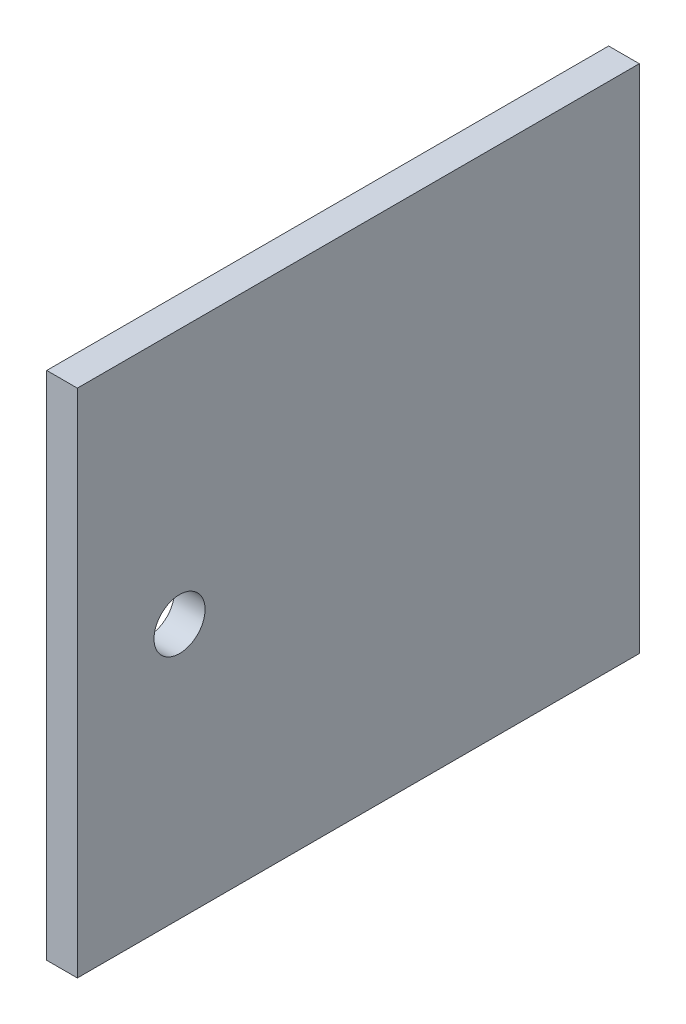
ISO-10303-21;
HEADER;
FILE_DESCRIPTION(('STEP AP214'),'2;1');
FILE_NAME('part.step','',(''),(''),'','','');
FILE_SCHEMA(('AUTOMOTIVE_DESIGN { 1 0 10303 214 1 1 1 1 }'));
ENDSEC;
DATA;
#1=APPLICATION_CONTEXT('core data for automotive mechanical design processes');
#2=APPLICATION_PROTOCOL_DEFINITION('international standard','automotive_design',2000,#1);
#3=PRODUCT_CONTEXT('',#1,'mechanical');
#4=PRODUCT('Part','Part','',(#3));
#5=PRODUCT_RELATED_PRODUCT_CATEGORY('part','',(#4));
#6=PRODUCT_DEFINITION_FORMATION('','',#4);
#7=PRODUCT_DEFINITION_CONTEXT('part definition',#1,'design');
#8=PRODUCT_DEFINITION('design','',#6,#7);
#9=PRODUCT_DEFINITION_SHAPE('','',#8);
#10=(LENGTH_UNIT() NAMED_UNIT(*) SI_UNIT(.MILLI.,.METRE.));
#11=(NAMED_UNIT(*) PLANE_ANGLE_UNIT() SI_UNIT($,.RADIAN.));
#12=(NAMED_UNIT(*) SI_UNIT($,.STERADIAN.) SOLID_ANGLE_UNIT());
#13=UNCERTAINTY_MEASURE_WITH_UNIT(LENGTH_MEASURE(1.E-05),#10,'distance_accuracy_value','');
#14=(GEOMETRIC_REPRESENTATION_CONTEXT(3) GLOBAL_UNCERTAINTY_ASSIGNED_CONTEXT((#13)) GLOBAL_UNIT_ASSIGNED_CONTEXT((#10,
#11,#12)) REPRESENTATION_CONTEXT('',''));
#15=CARTESIAN_POINT('',(0.,0.,0.));
#16=DIRECTION('',(0.,0.,1.));
#17=DIRECTION('',(1.,0.,0.));
#18=AXIS2_PLACEMENT_3D('',#15,#16,#17);
#19=CARTESIAN_POINT('',(-3.,0.,0.));
#20=DIRECTION('',(0.,0.,-1.));
#21=DIRECTION('',(0.,1.,0.));
#22=AXIS2_PLACEMENT_3D('',#19,#20,#21);
#23=PLANE('',#22);
#24=DIRECTION('',(0.,1.,0.));
#25=VECTOR('',#24,1.);
#26=CARTESIAN_POINT('',(0.,0.,0.));
#27=LINE('',#26,#25);
#28=CARTESIAN_POINT('',(0.,-50.,0.));
#29=VERTEX_POINT('',#28);
#30=CARTESIAN_POINT('',(0.,0.,0.));
#31=VERTEX_POINT('',#30);
#32=EDGE_CURVE('E86',#29,#31,#27,.T.);
#33=ORIENTED_EDGE('',*,*,#32,.F.);
#34=DIRECTION('',(1.,0.,0.));
#35=VECTOR('',#34,1.);
#36=CARTESIAN_POINT('',(-3.,-50.,0.));
#37=LINE('',#36,#35);
#38=CARTESIAN_POINT('',(-3.,-50.,0.));
#39=VERTEX_POINT('',#38);
#40=EDGE_CURVE('E32',#39,#29,#37,.T.);
#41=ORIENTED_EDGE('',*,*,#40,.F.);
#42=DIRECTION('',(0.,1.,0.));
#43=VECTOR('',#42,1.);
#44=CARTESIAN_POINT('',(-3.,0.,0.));
#45=LINE('',#44,#43);
#46=CARTESIAN_POINT('',(-3.,0.,0.));
#47=VERTEX_POINT('',#46);
#48=EDGE_CURVE('E71',#39,#47,#45,.T.);
#49=ORIENTED_EDGE('',*,*,#48,.T.);
#50=DIRECTION('',(1.,0.,0.));
#51=VECTOR('',#50,1.);
#52=CARTESIAN_POINT('',(-3.,0.,0.));
#53=LINE('',#52,#51);
#54=EDGE_CURVE('E10',#47,#31,#53,.T.);
#55=ORIENTED_EDGE('',*,*,#54,.T.);
#56=EDGE_LOOP('',(#33,#41,#49,#55));
#57=FACE_BOUND('',#56,.T.);
#58=ADVANCED_FACE('F16',(#57),#23,.T.);
#59=CARTESIAN_POINT('',(-3.,0.,55.));
#60=DIRECTION('',(0.,1.,0.));
#61=DIRECTION('',(0.,0.,1.));
#62=AXIS2_PLACEMENT_3D('',#59,#60,#61);
#63=PLANE('',#62);
#64=DIRECTION('',(0.,0.,1.));
#65=VECTOR('',#64,1.);
#66=CARTESIAN_POINT('',(0.,0.,55.));
#67=LINE('',#66,#65);
#68=CARTESIAN_POINT('',(0.,0.,55.));
#69=VERTEX_POINT('',#68);
#70=EDGE_CURVE('E83',#31,#69,#67,.T.);
#71=ORIENTED_EDGE('',*,*,#70,.F.);
#72=ORIENTED_EDGE('',*,*,#54,.F.);
#73=DIRECTION('',(0.,0.,1.));
#74=VECTOR('',#73,1.);
#75=CARTESIAN_POINT('',(-3.,0.,55.));
#76=LINE('',#75,#74);
#77=CARTESIAN_POINT('',(-3.,0.,55.));
#78=VERTEX_POINT('',#77);
#79=EDGE_CURVE('E67',#47,#78,#76,.T.);
#80=ORIENTED_EDGE('',*,*,#79,.T.);
#81=DIRECTION('',(1.,0.,0.));
#82=VECTOR('',#81,1.);
#83=CARTESIAN_POINT('',(-3.,0.,55.));
#84=LINE('',#83,#82);
#85=EDGE_CURVE('E24',#78,#69,#84,.T.);
#86=ORIENTED_EDGE('',*,*,#85,.T.);
#87=EDGE_LOOP('',(#71,#72,#80,#86));
#88=FACE_BOUND('',#87,.T.);
#89=ADVANCED_FACE('F68',(#88),#63,.T.);
#90=CARTESIAN_POINT('',(-3.,-50.,55.));
#91=DIRECTION('',(0.,0.,1.));
#92=DIRECTION('',(1.,0.,0.));
#93=AXIS2_PLACEMENT_3D('',#90,#91,#92);
#94=PLANE('',#93);
#95=DIRECTION('',(0.,-1.,0.));
#96=VECTOR('',#95,1.);
#97=CARTESIAN_POINT('',(0.,-50.,55.));
#98=LINE('',#97,#96);
#99=CARTESIAN_POINT('',(0.,-50.,55.));
#100=VERTEX_POINT('',#99);
#101=EDGE_CURVE('E65',#69,#100,#98,.T.);
#102=ORIENTED_EDGE('',*,*,#101,.F.);
#103=ORIENTED_EDGE('',*,*,#85,.F.);
#104=DIRECTION('',(0.,-1.,0.));
#105=VECTOR('',#104,1.);
#106=CARTESIAN_POINT('',(-3.,-50.,55.));
#107=LINE('',#106,#105);
#108=CARTESIAN_POINT('',(-3.,-50.,55.));
#109=VERTEX_POINT('',#108);
#110=EDGE_CURVE('E62',#78,#109,#107,.T.);
#111=ORIENTED_EDGE('',*,*,#110,.T.);
#112=DIRECTION('',(1.,0.,0.));
#113=VECTOR('',#112,1.);
#114=CARTESIAN_POINT('',(-3.,-50.,55.));
#115=LINE('',#114,#113);
#116=EDGE_CURVE('E48',#109,#100,#115,.T.);
#117=ORIENTED_EDGE('',*,*,#116,.T.);
#118=EDGE_LOOP('',(#102,#103,#111,#117));
#119=FACE_BOUND('',#118,.T.);
#120=ADVANCED_FACE('F60',(#119),#94,.T.);
#121=CARTESIAN_POINT('',(-3.,-25.,45.));
#122=DIRECTION('',(1.,0.,0.));
#123=DIRECTION('',(0.,0.,-1.));
#124=AXIS2_PLACEMENT_3D('',#121,#122,#123);
#125=CYLINDRICAL_SURFACE('',#124,2.5);
#126=CARTESIAN_POINT('',(-3.,-25.,45.));
#127=DIRECTION('',(1.,0.,0.));
#128=DIRECTION('',(0.,1.,0.));
#129=AXIS2_PLACEMENT_3D('',#126,#127,#128);
#130=CIRCLE('',#129,2.5);
#131=CARTESIAN_POINT('',(-3.,-22.5,45.));
#132=VERTEX_POINT('',#131);
#133=EDGE_CURVE('E76',#132,#132,#130,.T.);
#134=ORIENTED_EDGE('',*,*,#133,.F.);
#135=EDGE_LOOP('',(#134));
#136=FACE_BOUND('',#135,.T.);
#137=CARTESIAN_POINT('',(0.,-25.,45.));
#138=DIRECTION('',(1.,0.,0.));
#139=DIRECTION('',(0.,1.,0.));
#140=AXIS2_PLACEMENT_3D('',#137,#138,#139);
#141=CIRCLE('',#140,2.5);
#142=CARTESIAN_POINT('',(0.,-22.5,45.));
#143=VERTEX_POINT('',#142);
#144=EDGE_CURVE('E80',#143,#143,#141,.T.);
#145=ORIENTED_EDGE('',*,*,#144,.T.);
#146=EDGE_LOOP('',(#145));
#147=FACE_BOUND('',#146,.T.);
#148=ADVANCED_FACE('F103',(#136,#147),#125,.F.);
#149=CARTESIAN_POINT('',(-3.,-50.,0.));
#150=DIRECTION('',(0.,-1.,0.));
#151=DIRECTION('',(0.,0.,-1.));
#152=AXIS2_PLACEMENT_3D('',#149,#150,#151);
#153=PLANE('',#152);
#154=DIRECTION('',(0.,0.,-1.));
#155=VECTOR('',#154,1.);
#156=CARTESIAN_POINT('',(0.,-50.,0.));
#157=LINE('',#156,#155);
#158=EDGE_CURVE('E89',#100,#29,#157,.T.);
#159=ORIENTED_EDGE('',*,*,#158,.F.);
#160=ORIENTED_EDGE('',*,*,#116,.F.);
#161=DIRECTION('',(0.,0.,-1.));
#162=VECTOR('',#161,1.);
#163=CARTESIAN_POINT('',(-3.,-50.,0.));
#164=LINE('',#163,#162);
#165=EDGE_CURVE('E74',#109,#39,#164,.T.);
#166=ORIENTED_EDGE('',*,*,#165,.T.);
#167=ORIENTED_EDGE('',*,*,#40,.T.);
#168=EDGE_LOOP('',(#159,#160,#166,#167));
#169=FACE_BOUND('',#168,.T.);
#170=ADVANCED_FACE('F119',(#169),#153,.T.);
#171=CARTESIAN_POINT('',(-3.,0.,0.));
#172=DIRECTION('',(1.,0.,0.));
#173=DIRECTION('',(0.,1.,0.));
#174=AXIS2_PLACEMENT_3D('',#171,#172,#173);
#175=PLANE('',#174);
#176=ORIENTED_EDGE('',*,*,#133,.T.);
#177=EDGE_LOOP('',(#176));
#178=FACE_BOUND('',#177,.T.);
#179=ORIENTED_EDGE('',*,*,#48,.F.);
#180=ORIENTED_EDGE('',*,*,#165,.F.);
#181=ORIENTED_EDGE('',*,*,#110,.F.);
#182=ORIENTED_EDGE('',*,*,#79,.F.);
#183=EDGE_LOOP('',(#179,#180,#181,#182));
#184=FACE_BOUND('',#183,.T.);
#185=ADVANCED_FACE('F73',(#178,#184),#175,.F.);
#186=CARTESIAN_POINT('',(0.,0.,0.));
#187=DIRECTION('',(1.,0.,0.));
#188=DIRECTION('',(0.,1.,0.));
#189=AXIS2_PLACEMENT_3D('',#186,#187,#188);
#190=PLANE('',#189);
#191=ORIENTED_EDGE('',*,*,#144,.F.);
#192=EDGE_LOOP('',(#191));
#193=FACE_BOUND('',#192,.T.);
#194=ORIENTED_EDGE('',*,*,#32,.T.);
#195=ORIENTED_EDGE('',*,*,#70,.T.);
#196=ORIENTED_EDGE('',*,*,#101,.T.);
#197=ORIENTED_EDGE('',*,*,#158,.T.);
#198=EDGE_LOOP('',(#194,#195,#196,#197));
#199=FACE_BOUND('',#198,.T.);
#200=ADVANCED_FACE('F105',(#193,#199),#190,.T.);
#201=CLOSED_SHELL('',(#58,#89,#120,#148,#170,#185,#200));
#202=MANIFOLD_SOLID_BREP('B1',#201);
#203=ADVANCED_BREP_SHAPE_REPRESENTATION('',(#18,#202),#14);
#204=SHAPE_DEFINITION_REPRESENTATION(#9,#203);
ENDSEC;
END-ISO-10303-21;
